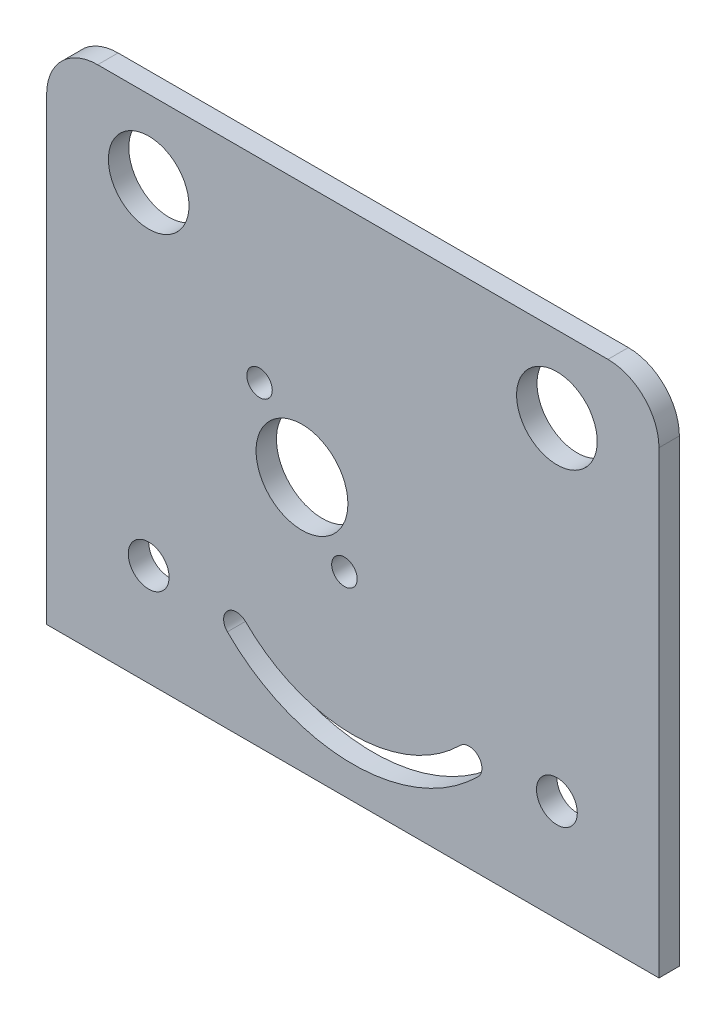
ISO-10303-21;
HEADER;
FILE_DESCRIPTION(('STEP AP214'),'2;1');
FILE_NAME('part.step','',(''),(''),'','','');
FILE_SCHEMA(('AUTOMOTIVE_DESIGN { 1 0 10303 214 1 1 1 1 }'));
ENDSEC;
DATA;
#1=APPLICATION_CONTEXT('core data for automotive mechanical design processes');
#2=APPLICATION_PROTOCOL_DEFINITION('international standard','automotive_design',2000,#1);
#3=PRODUCT_CONTEXT('',#1,'mechanical');
#4=PRODUCT('Part','Part','',(#3));
#5=PRODUCT_RELATED_PRODUCT_CATEGORY('part','',(#4));
#6=PRODUCT_DEFINITION_FORMATION('','',#4);
#7=PRODUCT_DEFINITION_CONTEXT('part definition',#1,'design');
#8=PRODUCT_DEFINITION('design','',#6,#7);
#9=PRODUCT_DEFINITION_SHAPE('','',#8);
#10=(LENGTH_UNIT() NAMED_UNIT(*) SI_UNIT(.MILLI.,.METRE.));
#11=(NAMED_UNIT(*) PLANE_ANGLE_UNIT() SI_UNIT($,.RADIAN.));
#12=(NAMED_UNIT(*) SI_UNIT($,.STERADIAN.) SOLID_ANGLE_UNIT());
#13=UNCERTAINTY_MEASURE_WITH_UNIT(LENGTH_MEASURE(1.E-05),#10,'distance_accuracy_value','');
#14=(GEOMETRIC_REPRESENTATION_CONTEXT(3) GLOBAL_UNCERTAINTY_ASSIGNED_CONTEXT((#13)) GLOBAL_UNIT_ASSIGNED_CONTEXT((#10,
#11,#12)) REPRESENTATION_CONTEXT('',''));
#15=CARTESIAN_POINT('',(0.,0.,0.));
#16=DIRECTION('',(0.,0.,1.));
#17=DIRECTION('',(1.,0.,0.));
#18=AXIS2_PLACEMENT_3D('',#15,#16,#17);
#19=CARTESIAN_POINT('',(10.,90.,4.));
#20=DIRECTION('',(0.,0.,-1.));
#21=DIRECTION('',(-1.,0.,0.));
#22=AXIS2_PLACEMENT_3D('',#19,#20,#21);
#23=PLANE('',#22);
#24=CARTESIAN_POINT('',(20.,20.,4.));
#25=DIRECTION('',(0.,0.,1.));
#26=DIRECTION('',(1.,0.,0.));
#27=AXIS2_PLACEMENT_3D('',#24,#25,#26);
#28=CIRCLE('',#27,4.);
#29=CARTESIAN_POINT('',(24.,20.,4.));
#30=VERTEX_POINT('',#29);
#31=EDGE_CURVE('E146',#30,#30,#28,.T.);
#32=ORIENTED_EDGE('',*,*,#31,.F.);
#33=EDGE_LOOP('',(#32));
#34=FACE_BOUND('',#33,.T.);
#35=CARTESIAN_POINT('',(41.7203438816653,61.8757338985937,4.));
#36=DIRECTION('',(0.,0.,1.));
#37=DIRECTION('',(1.,0.,0.));
#38=AXIS2_PLACEMENT_3D('',#35,#36,#37);
#39=CIRCLE('',#38,2.5);
#40=CARTESIAN_POINT('',(44.2203438816653,61.8757338985937,4.));
#41=VERTEX_POINT('',#40);
#42=EDGE_CURVE('E158',#41,#41,#39,.T.);
#43=ORIENTED_EDGE('',*,*,#42,.F.);
#44=EDGE_LOOP('',(#43));
#45=FACE_BOUND('',#44,.T.);
#46=CARTESIAN_POINT('',(50.0400160128128,50.,4.));
#47=DIRECTION('',(0.,0.,1.));
#48=DIRECTION('',(1.,0.,0.));
#49=AXIS2_PLACEMENT_3D('',#46,#47,#48);
#50=CIRCLE('',#49,9.00000000000002);
#51=CARTESIAN_POINT('',(59.0400160128128,50.,4.));
#52=VERTEX_POINT('',#51);
#53=EDGE_CURVE('E170',#52,#52,#50,.T.);
#54=ORIENTED_EDGE('',*,*,#53,.F.);
#55=EDGE_LOOP('',(#54));
#56=FACE_BOUND('',#55,.T.);
#57=CARTESIAN_POINT('',(100.,85.,4.));
#58=DIRECTION('',(0.,0.,1.));
#59=DIRECTION('',(1.,0.,0.));
#60=AXIS2_PLACEMENT_3D('',#57,#58,#59);
#61=CIRCLE('',#60,7.9);
#62=CARTESIAN_POINT('',(107.9,85.,4.));
#63=VERTEX_POINT('',#62);
#64=EDGE_CURVE('E182',#63,#63,#61,.T.);
#65=ORIENTED_EDGE('',*,*,#64,.F.);
#66=EDGE_LOOP('',(#65));
#67=FACE_BOUND('',#66,.T.);
#68=DIRECTION('',(0.,-1.,0.));
#69=VECTOR('',#68,1.);
#70=CARTESIAN_POINT('',(0.,0.,4.));
#71=LINE('',#70,#69);
#72=CARTESIAN_POINT('',(0.,89.9999999999999,4.));
#73=VERTEX_POINT('',#72);
#74=CARTESIAN_POINT('',(0.,0.,4.));
#75=VERTEX_POINT('',#74);
#76=EDGE_CURVE('E188',#73,#75,#71,.T.);
#77=ORIENTED_EDGE('',*,*,#76,.T.);
#78=DIRECTION('',(1.,0.,0.));
#79=VECTOR('',#78,1.);
#80=CARTESIAN_POINT('',(0.,0.,4.));
#81=LINE('',#80,#79);
#82=CARTESIAN_POINT('',(120.,0.,4.));
#83=VERTEX_POINT('',#82);
#84=EDGE_CURVE('E191',#75,#83,#81,.T.);
#85=ORIENTED_EDGE('',*,*,#84,.T.);
#86=DIRECTION('',(0.,1.,0.));
#87=VECTOR('',#86,1.);
#88=CARTESIAN_POINT('',(120.,0.,4.));
#89=LINE('',#88,#87);
#90=CARTESIAN_POINT('',(120.,89.9999999999999,4.));
#91=VERTEX_POINT('',#90);
#92=EDGE_CURVE('E194',#83,#91,#89,.T.);
#93=ORIENTED_EDGE('',*,*,#92,.T.);
#94=CARTESIAN_POINT('',(110.,90.,4.));
#95=DIRECTION('',(0.,0.,1.));
#96=DIRECTION('',(-1.,0.,0.));
#97=AXIS2_PLACEMENT_3D('',#94,#95,#96);
#98=CIRCLE('',#97,9.99999999999999);
#99=CARTESIAN_POINT('',(110.,100.,4.));
#100=VERTEX_POINT('',#99);
#101=EDGE_CURVE('E196',#91,#100,#98,.T.);
#102=ORIENTED_EDGE('',*,*,#101,.T.);
#103=DIRECTION('',(-1.,0.,0.));
#104=VECTOR('',#103,1.);
#105=CARTESIAN_POINT('',(10.0000000000001,100.,4.));
#106=LINE('',#105,#104);
#107=CARTESIAN_POINT('',(10.0000000000001,100.,4.));
#108=VERTEX_POINT('',#107);
#109=EDGE_CURVE('E198',#100,#108,#106,.T.);
#110=ORIENTED_EDGE('',*,*,#109,.T.);
#111=CARTESIAN_POINT('',(10.,90.,4.));
#112=DIRECTION('',(0.,0.,1.));
#113=DIRECTION('',(-1.,0.,0.));
#114=AXIS2_PLACEMENT_3D('',#111,#112,#113);
#115=CIRCLE('',#114,10.);
#116=EDGE_CURVE('E200',#108,#73,#115,.T.);
#117=ORIENTED_EDGE('',*,*,#116,.T.);
#118=EDGE_LOOP('',(#77,#85,#93,#102,#110,#117));
#119=FACE_BOUND('',#118,.T.);
#120=CARTESIAN_POINT('',(20.,85.,4.));
#121=DIRECTION('',(0.,0.,1.));
#122=DIRECTION('',(1.,0.,0.));
#123=AXIS2_PLACEMENT_3D('',#120,#121,#122);
#124=CIRCLE('',#123,7.89999999999999);
#125=CARTESIAN_POINT('',(27.9,85.,4.));
#126=VERTEX_POINT('',#125);
#127=EDGE_CURVE('E176',#126,#126,#124,.T.);
#128=ORIENTED_EDGE('',*,*,#127,.F.);
#129=EDGE_LOOP('',(#128));
#130=FACE_BOUND('',#129,.T.);
#131=CARTESIAN_POINT('',(58.3596881439604,38.1242661014063,4.));
#132=DIRECTION('',(0.,0.,1.));
#133=DIRECTION('',(1.,0.,0.));
#134=AXIS2_PLACEMENT_3D('',#131,#132,#133);
#135=CIRCLE('',#134,2.5);
#136=CARTESIAN_POINT('',(60.8596881439604,38.1242661014063,4.));
#137=VERTEX_POINT('',#136);
#138=EDGE_CURVE('E164',#137,#137,#135,.T.);
#139=ORIENTED_EDGE('',*,*,#138,.F.);
#140=EDGE_LOOP('',(#139));
#141=FACE_BOUND('',#140,.T.);
#142=CARTESIAN_POINT('',(100.,20.,4.));
#143=DIRECTION('',(0.,0.,1.));
#144=DIRECTION('',(1.,0.,0.));
#145=AXIS2_PLACEMENT_3D('',#142,#143,#144);
#146=CIRCLE('',#145,4.00000000000001);
#147=CARTESIAN_POINT('',(104.,20.,4.));
#148=VERTEX_POINT('',#147);
#149=EDGE_CURVE('E152',#148,#148,#146,.T.);
#150=ORIENTED_EDGE('',*,*,#149,.F.);
#151=EDGE_LOOP('',(#150));
#152=FACE_BOUND('',#151,.T.);
#153=CARTESIAN_POINT('',(37.192068780406,18.2322330470336,4.));
#154=DIRECTION('',(0.,0.,1.));
#155=DIRECTION('',(-1.,0.,0.));
#156=AXIS2_PLACEMENT_3D('',#153,#154,#155);
#157=CIRCLE('',#156,2.5);
#158=CARTESIAN_POINT('',(38.9598357333724,20.,4.));
#159=VERTEX_POINT('',#158);
#160=CARTESIAN_POINT('',(35.4243018274396,16.4644660940673,4.));
#161=VERTEX_POINT('',#160);
#162=EDGE_CURVE('E110',#159,#161,#157,.T.);
#163=ORIENTED_EDGE('',*,*,#162,.F.);
#164=CARTESIAN_POINT('',(60.,41.0401642666277,4.));
#165=DIRECTION('',(0.,0.,-1.));
#166=DIRECTION('',(1.,0.,0.));
#167=AXIS2_PLACEMENT_3D('',#164,#165,#166);
#168=CIRCLE('',#167,29.7552856604226);
#169=CARTESIAN_POINT('',(81.0401642666276,20.,4.));
#170=VERTEX_POINT('',#169);
#171=EDGE_CURVE('E132',#170,#159,#168,.T.);
#172=ORIENTED_EDGE('',*,*,#171,.F.);
#173=CARTESIAN_POINT('',(82.807931219594,18.2322330470336,4.));
#174=DIRECTION('',(0.,0.,1.));
#175=DIRECTION('',(-1.,0.,0.));
#176=AXIS2_PLACEMENT_3D('',#173,#174,#175);
#177=CIRCLE('',#176,2.49999999999999);
#178=CARTESIAN_POINT('',(84.5756981725604,16.4644660940673,4.));
#179=VERTEX_POINT('',#178);
#180=EDGE_CURVE('E130',#179,#170,#177,.T.);
#181=ORIENTED_EDGE('',*,*,#180,.F.);
#182=CARTESIAN_POINT('',(60.,41.0401642666277,4.));
#183=DIRECTION('',(0.,0.,1.));
#184=DIRECTION('',(1.,0.,0.));
#185=AXIS2_PLACEMENT_3D('',#182,#183,#184);
#186=CIRCLE('',#185,34.7552856604226);
#187=EDGE_CURVE('E118',#161,#179,#186,.T.);
#188=ORIENTED_EDGE('',*,*,#187,.F.);
#189=EDGE_LOOP('',(#163,#172,#181,#188));
#190=FACE_BOUND('',#189,.T.);
#191=ADVANCED_FACE('F33',(#34,#45,#56,#67,#119,#130,#141,#152,#190),#23,.F.);
#192=CARTESIAN_POINT('',(10.,90.,0.));
#193=DIRECTION('',(0.,0.,-1.));
#194=DIRECTION('',(-1.,0.,0.));
#195=AXIS2_PLACEMENT_3D('',#192,#193,#194);
#196=PLANE('',#195);
#197=CARTESIAN_POINT('',(20.,20.,0.));
#198=DIRECTION('',(0.,0.,1.));
#199=DIRECTION('',(1.,0.,0.));
#200=AXIS2_PLACEMENT_3D('',#197,#198,#199);
#201=CIRCLE('',#200,4.);
#202=CARTESIAN_POINT('',(24.,20.,0.));
#203=VERTEX_POINT('',#202);
#204=EDGE_CURVE('E126',#203,#203,#201,.T.);
#205=ORIENTED_EDGE('',*,*,#204,.T.);
#206=EDGE_LOOP('',(#205));
#207=FACE_BOUND('',#206,.T.);
#208=CARTESIAN_POINT('',(41.7203438816653,61.8757338985937,0.));
#209=DIRECTION('',(0.,0.,1.));
#210=DIRECTION('',(1.,0.,0.));
#211=AXIS2_PLACEMENT_3D('',#208,#209,#210);
#212=CIRCLE('',#211,2.5);
#213=CARTESIAN_POINT('',(44.2203438816653,61.8757338985937,0.));
#214=VERTEX_POINT('',#213);
#215=EDGE_CURVE('E155',#214,#214,#212,.T.);
#216=ORIENTED_EDGE('',*,*,#215,.T.);
#217=EDGE_LOOP('',(#216));
#218=FACE_BOUND('',#217,.T.);
#219=CARTESIAN_POINT('',(50.0400160128128,50.,0.));
#220=DIRECTION('',(0.,0.,1.));
#221=DIRECTION('',(1.,0.,0.));
#222=AXIS2_PLACEMENT_3D('',#219,#220,#221);
#223=CIRCLE('',#222,9.00000000000002);
#224=CARTESIAN_POINT('',(59.0400160128128,50.,0.));
#225=VERTEX_POINT('',#224);
#226=EDGE_CURVE('E167',#225,#225,#223,.T.);
#227=ORIENTED_EDGE('',*,*,#226,.T.);
#228=EDGE_LOOP('',(#227));
#229=FACE_BOUND('',#228,.T.);
#230=CARTESIAN_POINT('',(100.,85.,0.));
#231=DIRECTION('',(0.,0.,1.));
#232=DIRECTION('',(1.,0.,0.));
#233=AXIS2_PLACEMENT_3D('',#230,#231,#232);
#234=CIRCLE('',#233,7.9);
#235=CARTESIAN_POINT('',(107.9,85.,0.));
#236=VERTEX_POINT('',#235);
#237=EDGE_CURVE('E179',#236,#236,#234,.T.);
#238=ORIENTED_EDGE('',*,*,#237,.T.);
#239=EDGE_LOOP('',(#238));
#240=FACE_BOUND('',#239,.T.);
#241=DIRECTION('',(0.,-1.,0.));
#242=VECTOR('',#241,1.);
#243=CARTESIAN_POINT('',(0.,0.,0.));
#244=LINE('',#243,#242);
#245=CARTESIAN_POINT('',(0.,89.9999999999999,0.));
#246=VERTEX_POINT('',#245);
#247=CARTESIAN_POINT('',(0.,0.,0.));
#248=VERTEX_POINT('',#247);
#249=EDGE_CURVE('E185',#246,#248,#244,.T.);
#250=ORIENTED_EDGE('',*,*,#249,.F.);
#251=CARTESIAN_POINT('',(10.,90.,0.));
#252=DIRECTION('',(0.,0.,1.));
#253=DIRECTION('',(-1.,0.,0.));
#254=AXIS2_PLACEMENT_3D('',#251,#252,#253);
#255=CIRCLE('',#254,10.);
#256=CARTESIAN_POINT('',(10.0000000000001,100.,0.));
#257=VERTEX_POINT('',#256);
#258=EDGE_CURVE('E192',#257,#246,#255,.T.);
#259=ORIENTED_EDGE('',*,*,#258,.F.);
#260=DIRECTION('',(-1.,0.,0.));
#261=VECTOR('',#260,1.);
#262=CARTESIAN_POINT('',(10.0000000000001,100.,0.));
#263=LINE('',#262,#261);
#264=CARTESIAN_POINT('',(110.,100.,0.));
#265=VERTEX_POINT('',#264);
#266=EDGE_CURVE('E211',#265,#257,#263,.T.);
#267=ORIENTED_EDGE('',*,*,#266,.F.);
#268=CARTESIAN_POINT('',(110.,90.,0.));
#269=DIRECTION('',(0.,0.,1.));
#270=DIRECTION('',(-1.,0.,0.));
#271=AXIS2_PLACEMENT_3D('',#268,#269,#270);
#272=CIRCLE('',#271,9.99999999999999);
#273=CARTESIAN_POINT('',(120.,89.9999999999999,0.));
#274=VERTEX_POINT('',#273);
#275=EDGE_CURVE('E209',#274,#265,#272,.T.);
#276=ORIENTED_EDGE('',*,*,#275,.F.);
#277=DIRECTION('',(0.,1.,0.));
#278=VECTOR('',#277,1.);
#279=CARTESIAN_POINT('',(120.,0.,0.));
#280=LINE('',#279,#278);
#281=CARTESIAN_POINT('',(120.,0.,0.));
#282=VERTEX_POINT('',#281);
#283=EDGE_CURVE('E207',#282,#274,#280,.T.);
#284=ORIENTED_EDGE('',*,*,#283,.F.);
#285=DIRECTION('',(1.,0.,0.));
#286=VECTOR('',#285,1.);
#287=CARTESIAN_POINT('',(0.,0.,0.));
#288=LINE('',#287,#286);
#289=EDGE_CURVE('E205',#248,#282,#288,.T.);
#290=ORIENTED_EDGE('',*,*,#289,.F.);
#291=EDGE_LOOP('',(#250,#259,#267,#276,#284,#290));
#292=FACE_BOUND('',#291,.T.);
#293=CARTESIAN_POINT('',(20.,85.,0.));
#294=DIRECTION('',(0.,0.,1.));
#295=DIRECTION('',(1.,0.,0.));
#296=AXIS2_PLACEMENT_3D('',#293,#294,#295);
#297=CIRCLE('',#296,7.89999999999999);
#298=CARTESIAN_POINT('',(27.9,85.,0.));
#299=VERTEX_POINT('',#298);
#300=EDGE_CURVE('E173',#299,#299,#297,.T.);
#301=ORIENTED_EDGE('',*,*,#300,.T.);
#302=EDGE_LOOP('',(#301));
#303=FACE_BOUND('',#302,.T.);
#304=CARTESIAN_POINT('',(58.3596881439604,38.1242661014063,0.));
#305=DIRECTION('',(0.,0.,1.));
#306=DIRECTION('',(1.,0.,0.));
#307=AXIS2_PLACEMENT_3D('',#304,#305,#306);
#308=CIRCLE('',#307,2.5);
#309=CARTESIAN_POINT('',(60.8596881439604,38.1242661014063,0.));
#310=VERTEX_POINT('',#309);
#311=EDGE_CURVE('E161',#310,#310,#308,.T.);
#312=ORIENTED_EDGE('',*,*,#311,.T.);
#313=EDGE_LOOP('',(#312));
#314=FACE_BOUND('',#313,.T.);
#315=CARTESIAN_POINT('',(100.,20.,0.));
#316=DIRECTION('',(0.,0.,1.));
#317=DIRECTION('',(1.,0.,0.));
#318=AXIS2_PLACEMENT_3D('',#315,#316,#317);
#319=CIRCLE('',#318,4.00000000000001);
#320=CARTESIAN_POINT('',(104.,20.,0.));
#321=VERTEX_POINT('',#320);
#322=EDGE_CURVE('E149',#321,#321,#319,.T.);
#323=ORIENTED_EDGE('',*,*,#322,.T.);
#324=EDGE_LOOP('',(#323));
#325=FACE_BOUND('',#324,.T.);
#326=CARTESIAN_POINT('',(60.,41.0401642666277,0.));
#327=DIRECTION('',(0.,0.,-1.));
#328=DIRECTION('',(1.,0.,0.));
#329=AXIS2_PLACEMENT_3D('',#326,#327,#328);
#330=CIRCLE('',#329,29.7552856604226);
#331=CARTESIAN_POINT('',(81.0401642666276,20.,0.));
#332=VERTEX_POINT('',#331);
#333=CARTESIAN_POINT('',(38.9598357333724,20.,0.));
#334=VERTEX_POINT('',#333);
#335=EDGE_CURVE('E119',#332,#334,#330,.T.);
#336=ORIENTED_EDGE('',*,*,#335,.T.);
#337=CARTESIAN_POINT('',(37.192068780406,18.2322330470336,0.));
#338=DIRECTION('',(0.,0.,1.));
#339=DIRECTION('',(-1.,0.,0.));
#340=AXIS2_PLACEMENT_3D('',#337,#338,#339);
#341=CIRCLE('',#340,2.5);
#342=CARTESIAN_POINT('',(35.4243018274396,16.4644660940673,0.));
#343=VERTEX_POINT('',#342);
#344=EDGE_CURVE('E56',#334,#343,#341,.T.);
#345=ORIENTED_EDGE('',*,*,#344,.T.);
#346=CARTESIAN_POINT('',(60.,41.0401642666277,0.));
#347=DIRECTION('',(0.,0.,1.));
#348=DIRECTION('',(1.,0.,0.));
#349=AXIS2_PLACEMENT_3D('',#346,#347,#348);
#350=CIRCLE('',#349,34.7552856604226);
#351=CARTESIAN_POINT('',(84.5756981725604,16.4644660940673,0.));
#352=VERTEX_POINT('',#351);
#353=EDGE_CURVE('E125',#343,#352,#350,.T.);
#354=ORIENTED_EDGE('',*,*,#353,.T.);
#355=CARTESIAN_POINT('',(82.807931219594,18.2322330470336,0.));
#356=DIRECTION('',(0.,0.,1.));
#357=DIRECTION('',(-1.,0.,0.));
#358=AXIS2_PLACEMENT_3D('',#355,#356,#357);
#359=CIRCLE('',#358,2.49999999999999);
#360=EDGE_CURVE('E138',#352,#332,#359,.T.);
#361=ORIENTED_EDGE('',*,*,#360,.T.);
#362=EDGE_LOOP('',(#336,#345,#354,#361));
#363=FACE_BOUND('',#362,.T.);
#364=ADVANCED_FACE('F235',(#207,#218,#229,#240,#292,#303,#314,#325,#363),#196,.T.);
#365=CARTESIAN_POINT('',(0.,0.,4.));
#366=DIRECTION('',(1.,0.,0.));
#367=DIRECTION('',(0.,0.,-1.));
#368=AXIS2_PLACEMENT_3D('',#365,#366,#367);
#369=PLANE('',#368);
#370=ORIENTED_EDGE('',*,*,#249,.T.);
#371=DIRECTION('',(0.,0.,-1.));
#372=VECTOR('',#371,1.);
#373=CARTESIAN_POINT('',(0.,0.,4.));
#374=LINE('',#373,#372);
#375=EDGE_CURVE('E11',#75,#248,#374,.T.);
#376=ORIENTED_EDGE('',*,*,#375,.F.);
#377=ORIENTED_EDGE('',*,*,#76,.F.);
#378=DIRECTION('',(0.,0.,-1.));
#379=VECTOR('',#378,1.);
#380=CARTESIAN_POINT('',(0.,89.9999999999999,4.));
#381=LINE('',#380,#379);
#382=EDGE_CURVE('E202',#73,#246,#381,.T.);
#383=ORIENTED_EDGE('',*,*,#382,.T.);
#384=EDGE_LOOP('',(#370,#376,#377,#383));
#385=FACE_BOUND('',#384,.T.);
#386=ADVANCED_FACE('F35',(#385),#369,.F.);
#387=CARTESIAN_POINT('',(0.,0.,4.));
#388=DIRECTION('',(0.,1.,0.));
#389=DIRECTION('',(0.,0.,1.));
#390=AXIS2_PLACEMENT_3D('',#387,#388,#389);
#391=PLANE('',#390);
#392=ORIENTED_EDGE('',*,*,#289,.T.);
#393=DIRECTION('',(0.,0.,-1.));
#394=VECTOR('',#393,1.);
#395=CARTESIAN_POINT('',(120.,0.,4.));
#396=LINE('',#395,#394);
#397=EDGE_CURVE('E41',#83,#282,#396,.T.);
#398=ORIENTED_EDGE('',*,*,#397,.F.);
#399=ORIENTED_EDGE('',*,*,#84,.F.);
#400=ORIENTED_EDGE('',*,*,#375,.T.);
#401=EDGE_LOOP('',(#392,#398,#399,#400));
#402=FACE_BOUND('',#401,.T.);
#403=ADVANCED_FACE('F253',(#402),#391,.F.);
#404=CARTESIAN_POINT('',(120.,0.,4.));
#405=DIRECTION('',(-1.,0.,0.));
#406=DIRECTION('',(0.,0.,1.));
#407=AXIS2_PLACEMENT_3D('',#404,#405,#406);
#408=PLANE('',#407);
#409=ORIENTED_EDGE('',*,*,#283,.T.);
#410=DIRECTION('',(0.,0.,-1.));
#411=VECTOR('',#410,1.);
#412=CARTESIAN_POINT('',(120.,89.9999999999999,4.));
#413=LINE('',#412,#411);
#414=EDGE_CURVE('E222',#91,#274,#413,.T.);
#415=ORIENTED_EDGE('',*,*,#414,.F.);
#416=ORIENTED_EDGE('',*,*,#92,.F.);
#417=ORIENTED_EDGE('',*,*,#397,.T.);
#418=EDGE_LOOP('',(#409,#415,#416,#417));
#419=FACE_BOUND('',#418,.T.);
#420=ADVANCED_FACE('F229',(#419),#408,.F.);
#421=CARTESIAN_POINT('',(110.,90.,4.));
#422=DIRECTION('',(0.,0.,-1.));
#423=DIRECTION('',(-1.,0.,0.));
#424=AXIS2_PLACEMENT_3D('',#421,#422,#423);
#425=CYLINDRICAL_SURFACE('',#424,9.99999999999999);
#426=ORIENTED_EDGE('',*,*,#275,.T.);
#427=DIRECTION('',(0.,0.,-1.));
#428=VECTOR('',#427,1.);
#429=CARTESIAN_POINT('',(110.,100.,4.));
#430=LINE('',#429,#428);
#431=EDGE_CURVE('E219',#100,#265,#430,.T.);
#432=ORIENTED_EDGE('',*,*,#431,.F.);
#433=ORIENTED_EDGE('',*,*,#101,.F.);
#434=ORIENTED_EDGE('',*,*,#414,.T.);
#435=EDGE_LOOP('',(#426,#432,#433,#434));
#436=FACE_BOUND('',#435,.T.);
#437=ADVANCED_FACE('F241',(#436),#425,.T.);
#438=CARTESIAN_POINT('',(10.0000000000001,100.,4.));
#439=DIRECTION('',(0.,-1.,0.));
#440=DIRECTION('',(1.,0.,0.));
#441=AXIS2_PLACEMENT_3D('',#438,#439,#440);
#442=PLANE('',#441);
#443=ORIENTED_EDGE('',*,*,#266,.T.);
#444=DIRECTION('',(0.,0.,-1.));
#445=VECTOR('',#444,1.);
#446=CARTESIAN_POINT('',(10.0000000000001,100.,4.));
#447=LINE('',#446,#445);
#448=EDGE_CURVE('E216',#108,#257,#447,.T.);
#449=ORIENTED_EDGE('',*,*,#448,.F.);
#450=ORIENTED_EDGE('',*,*,#109,.F.);
#451=ORIENTED_EDGE('',*,*,#431,.T.);
#452=EDGE_LOOP('',(#443,#449,#450,#451));
#453=FACE_BOUND('',#452,.T.);
#454=ADVANCED_FACE('F245',(#453),#442,.F.);
#455=CARTESIAN_POINT('',(10.,90.,4.));
#456=DIRECTION('',(0.,0.,-1.));
#457=DIRECTION('',(-1.,0.,0.));
#458=AXIS2_PLACEMENT_3D('',#455,#456,#457);
#459=CYLINDRICAL_SURFACE('',#458,10.);
#460=ORIENTED_EDGE('',*,*,#258,.T.);
#461=ORIENTED_EDGE('',*,*,#382,.F.);
#462=ORIENTED_EDGE('',*,*,#116,.F.);
#463=ORIENTED_EDGE('',*,*,#448,.T.);
#464=EDGE_LOOP('',(#460,#461,#462,#463));
#465=FACE_BOUND('',#464,.T.);
#466=ADVANCED_FACE('F256',(#465),#459,.T.);
#467=CARTESIAN_POINT('',(100.,85.,4.));
#468=DIRECTION('',(0.,0.,-1.));
#469=DIRECTION('',(-1.,0.,0.));
#470=AXIS2_PLACEMENT_3D('',#467,#468,#469);
#471=CYLINDRICAL_SURFACE('',#470,7.9);
#472=ORIENTED_EDGE('',*,*,#64,.T.);
#473=EDGE_LOOP('',(#472));
#474=FACE_BOUND('',#473,.T.);
#475=ORIENTED_EDGE('',*,*,#237,.F.);
#476=EDGE_LOOP('',(#475));
#477=FACE_BOUND('',#476,.T.);
#478=ADVANCED_FACE('F258',(#474,#477),#471,.F.);
#479=CARTESIAN_POINT('',(20.,85.,4.));
#480=DIRECTION('',(0.,0.,-1.));
#481=DIRECTION('',(-1.,0.,0.));
#482=AXIS2_PLACEMENT_3D('',#479,#480,#481);
#483=CYLINDRICAL_SURFACE('',#482,7.89999999999999);
#484=ORIENTED_EDGE('',*,*,#127,.T.);
#485=EDGE_LOOP('',(#484));
#486=FACE_BOUND('',#485,.T.);
#487=ORIENTED_EDGE('',*,*,#300,.F.);
#488=EDGE_LOOP('',(#487));
#489=FACE_BOUND('',#488,.T.);
#490=ADVANCED_FACE('F264',(#486,#489),#483,.F.);
#491=CARTESIAN_POINT('',(50.0400160128128,50.,4.));
#492=DIRECTION('',(0.,0.,-1.));
#493=DIRECTION('',(-1.,0.,0.));
#494=AXIS2_PLACEMENT_3D('',#491,#492,#493);
#495=CYLINDRICAL_SURFACE('',#494,9.00000000000002);
#496=ORIENTED_EDGE('',*,*,#53,.T.);
#497=EDGE_LOOP('',(#496));
#498=FACE_BOUND('',#497,.T.);
#499=ORIENTED_EDGE('',*,*,#226,.F.);
#500=EDGE_LOOP('',(#499));
#501=FACE_BOUND('',#500,.T.);
#502=ADVANCED_FACE('F281',(#498,#501),#495,.F.);
#503=CARTESIAN_POINT('',(58.3596881439604,38.1242661014063,4.));
#504=DIRECTION('',(0.,0.,-1.));
#505=DIRECTION('',(-1.,0.,0.));
#506=AXIS2_PLACEMENT_3D('',#503,#504,#505);
#507=CYLINDRICAL_SURFACE('',#506,2.5);
#508=ORIENTED_EDGE('',*,*,#138,.T.);
#509=EDGE_LOOP('',(#508));
#510=FACE_BOUND('',#509,.T.);
#511=ORIENTED_EDGE('',*,*,#311,.F.);
#512=EDGE_LOOP('',(#511));
#513=FACE_BOUND('',#512,.T.);
#514=ADVANCED_FACE('F285',(#510,#513),#507,.F.);
#515=CARTESIAN_POINT('',(41.7203438816653,61.8757338985937,4.));
#516=DIRECTION('',(0.,0.,-1.));
#517=DIRECTION('',(-1.,0.,0.));
#518=AXIS2_PLACEMENT_3D('',#515,#516,#517);
#519=CYLINDRICAL_SURFACE('',#518,2.5);
#520=ORIENTED_EDGE('',*,*,#42,.T.);
#521=EDGE_LOOP('',(#520));
#522=FACE_BOUND('',#521,.T.);
#523=ORIENTED_EDGE('',*,*,#215,.F.);
#524=EDGE_LOOP('',(#523));
#525=FACE_BOUND('',#524,.T.);
#526=ADVANCED_FACE('F289',(#522,#525),#519,.F.);
#527=CARTESIAN_POINT('',(100.,20.,4.));
#528=DIRECTION('',(0.,0.,-1.));
#529=DIRECTION('',(-1.,0.,0.));
#530=AXIS2_PLACEMENT_3D('',#527,#528,#529);
#531=CYLINDRICAL_SURFACE('',#530,4.00000000000001);
#532=ORIENTED_EDGE('',*,*,#149,.T.);
#533=EDGE_LOOP('',(#532));
#534=FACE_BOUND('',#533,.T.);
#535=ORIENTED_EDGE('',*,*,#322,.F.);
#536=EDGE_LOOP('',(#535));
#537=FACE_BOUND('',#536,.T.);
#538=ADVANCED_FACE('F293',(#534,#537),#531,.F.);
#539=CARTESIAN_POINT('',(20.,20.,4.));
#540=DIRECTION('',(0.,0.,-1.));
#541=DIRECTION('',(-1.,0.,0.));
#542=AXIS2_PLACEMENT_3D('',#539,#540,#541);
#543=CYLINDRICAL_SURFACE('',#542,4.);
#544=ORIENTED_EDGE('',*,*,#31,.T.);
#545=EDGE_LOOP('',(#544));
#546=FACE_BOUND('',#545,.T.);
#547=ORIENTED_EDGE('',*,*,#204,.F.);
#548=EDGE_LOOP('',(#547));
#549=FACE_BOUND('',#548,.T.);
#550=ADVANCED_FACE('F297',(#546,#549),#543,.F.);
#551=CARTESIAN_POINT('',(37.192068780406,18.2322330470336,4.));
#552=DIRECTION('',(0.,0.,-1.));
#553=DIRECTION('',(-1.,0.,0.));
#554=AXIS2_PLACEMENT_3D('',#551,#552,#553);
#555=CYLINDRICAL_SURFACE('',#554,2.5);
#556=ORIENTED_EDGE('',*,*,#344,.F.);
#557=DIRECTION('',(0.,0.,-1.));
#558=VECTOR('',#557,1.);
#559=CARTESIAN_POINT('',(38.9598357333724,20.,4.));
#560=LINE('',#559,#558);
#561=EDGE_CURVE('E114',#159,#334,#560,.T.);
#562=ORIENTED_EDGE('',*,*,#561,.F.);
#563=ORIENTED_EDGE('',*,*,#162,.T.);
#564=DIRECTION('',(0.,0.,-1.));
#565=VECTOR('',#564,1.);
#566=CARTESIAN_POINT('',(35.4243018274396,16.4644660940673,4.));
#567=LINE('',#566,#565);
#568=EDGE_CURVE('E113',#161,#343,#567,.T.);
#569=ORIENTED_EDGE('',*,*,#568,.T.);
#570=EDGE_LOOP('',(#556,#562,#563,#569));
#571=FACE_BOUND('',#570,.T.);
#572=ADVANCED_FACE('F112',(#571),#555,.F.);
#573=CARTESIAN_POINT('',(60.,41.0401642666277,4.));
#574=DIRECTION('',(0.,0.,-1.));
#575=DIRECTION('',(-1.,0.,0.));
#576=AXIS2_PLACEMENT_3D('',#573,#574,#575);
#577=CYLINDRICAL_SURFACE('',#576,34.7552856604226);
#578=ORIENTED_EDGE('',*,*,#353,.F.);
#579=ORIENTED_EDGE('',*,*,#568,.F.);
#580=ORIENTED_EDGE('',*,*,#187,.T.);
#581=DIRECTION('',(0.,0.,-1.));
#582=VECTOR('',#581,1.);
#583=CARTESIAN_POINT('',(84.5756981725604,16.4644660940673,4.));
#584=LINE('',#583,#582);
#585=EDGE_CURVE('E127',#179,#352,#584,.T.);
#586=ORIENTED_EDGE('',*,*,#585,.T.);
#587=EDGE_LOOP('',(#578,#579,#580,#586));
#588=FACE_BOUND('',#587,.T.);
#589=ADVANCED_FACE('F122',(#588),#577,.F.);
#590=CARTESIAN_POINT('',(82.807931219594,18.2322330470336,4.));
#591=DIRECTION('',(0.,0.,-1.));
#592=DIRECTION('',(-1.,0.,0.));
#593=AXIS2_PLACEMENT_3D('',#590,#591,#592);
#594=CYLINDRICAL_SURFACE('',#593,2.49999999999999);
#595=ORIENTED_EDGE('',*,*,#360,.F.);
#596=ORIENTED_EDGE('',*,*,#585,.F.);
#597=ORIENTED_EDGE('',*,*,#180,.T.);
#598=DIRECTION('',(0.,0.,-1.));
#599=VECTOR('',#598,1.);
#600=CARTESIAN_POINT('',(81.0401642666276,20.,4.));
#601=LINE('',#600,#599);
#602=EDGE_CURVE('E48',#170,#332,#601,.T.);
#603=ORIENTED_EDGE('',*,*,#602,.T.);
#604=EDGE_LOOP('',(#595,#596,#597,#603));
#605=FACE_BOUND('',#604,.T.);
#606=ADVANCED_FACE('F306',(#605),#594,.F.);
#607=CARTESIAN_POINT('',(60.,41.0401642666277,4.));
#608=DIRECTION('',(0.,0.,-1.));
#609=DIRECTION('',(-1.,0.,0.));
#610=AXIS2_PLACEMENT_3D('',#607,#608,#609);
#611=CYLINDRICAL_SURFACE('',#610,29.7552856604226);
#612=ORIENTED_EDGE('',*,*,#335,.F.);
#613=ORIENTED_EDGE('',*,*,#602,.F.);
#614=ORIENTED_EDGE('',*,*,#171,.T.);
#615=ORIENTED_EDGE('',*,*,#561,.T.);
#616=EDGE_LOOP('',(#612,#613,#614,#615));
#617=FACE_BOUND('',#616,.T.);
#618=ADVANCED_FACE('F309',(#617),#611,.T.);
#619=CLOSED_SHELL('',(#191,#364,#386,#403,#420,#437,#454,#466,#478,#490,#502,#514,#526,#538,
#550,#572,#589,#606,#618));
#620=MANIFOLD_SOLID_BREP('B2',#619);
#621=ADVANCED_BREP_SHAPE_REPRESENTATION('',(#18,#620),#14);
#622=SHAPE_DEFINITION_REPRESENTATION(#9,#621);
ENDSEC;
END-ISO-10303-21;
